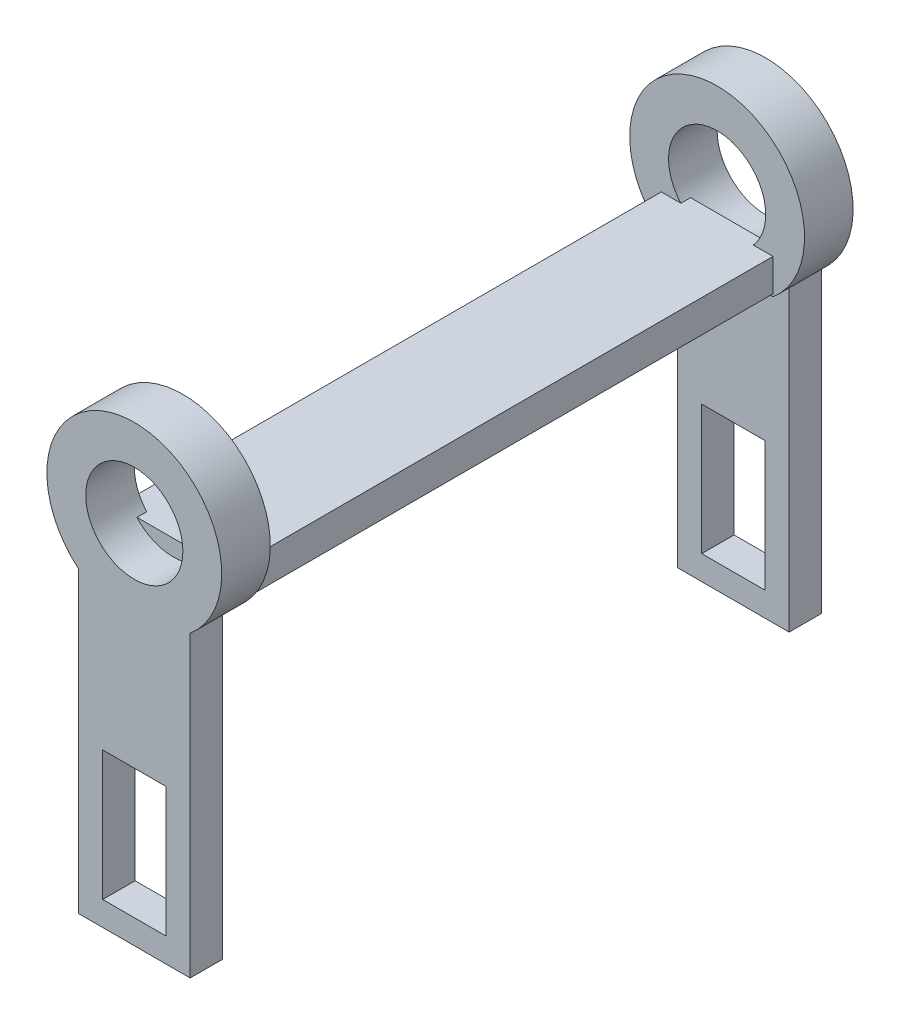
ISO-10303-21;
HEADER;
FILE_DESCRIPTION(('STEP AP214'),'2;1');
FILE_NAME('part.step','',(''),(''),'','','');
FILE_SCHEMA(('AUTOMOTIVE_DESIGN { 1 0 10303 214 1 1 1 1 }'));
ENDSEC;
DATA;
#1=APPLICATION_CONTEXT('core data for automotive mechanical design processes');
#2=APPLICATION_PROTOCOL_DEFINITION('international standard','automotive_design',2000,#1);
#3=PRODUCT_CONTEXT('',#1,'mechanical');
#4=PRODUCT('Part','Part','',(#3));
#5=PRODUCT_RELATED_PRODUCT_CATEGORY('part','',(#4));
#6=PRODUCT_DEFINITION_FORMATION('','',#4);
#7=PRODUCT_DEFINITION_CONTEXT('part definition',#1,'design');
#8=PRODUCT_DEFINITION('design','',#6,#7);
#9=PRODUCT_DEFINITION_SHAPE('','',#8);
#10=(LENGTH_UNIT() NAMED_UNIT(*) SI_UNIT(.MILLI.,.METRE.));
#11=(NAMED_UNIT(*) PLANE_ANGLE_UNIT() SI_UNIT($,.RADIAN.));
#12=(NAMED_UNIT(*) SI_UNIT($,.STERADIAN.) SOLID_ANGLE_UNIT());
#13=UNCERTAINTY_MEASURE_WITH_UNIT(LENGTH_MEASURE(1.E-05),#10,'distance_accuracy_value','');
#14=(GEOMETRIC_REPRESENTATION_CONTEXT(3) GLOBAL_UNCERTAINTY_ASSIGNED_CONTEXT((#13)) GLOBAL_UNIT_ASSIGNED_CONTEXT((#10,
#11,#12)) REPRESENTATION_CONTEXT('',''));
#15=CARTESIAN_POINT('',(0.,0.,0.));
#16=DIRECTION('',(0.,0.,1.));
#17=DIRECTION('',(1.,0.,0.));
#18=AXIS2_PLACEMENT_3D('',#15,#16,#17);
#19=CARTESIAN_POINT('',(0.,75.5,0.));
#20=DIRECTION('',(0.,1.,0.));
#21=DIRECTION('',(0.,0.,1.));
#22=AXIS2_PLACEMENT_3D('',#19,#20,#21);
#23=PLANE('',#22);
#24=DIRECTION('',(0.,0.,-1.));
#25=VECTOR('',#24,1.);
#26=CARTESIAN_POINT('',(11.180339887499,75.5,15.));
#27=LINE('',#26,#25);
#28=CARTESIAN_POINT('',(11.180339887499,75.5,15.));
#29=VERTEX_POINT('',#28);
#30=CARTESIAN_POINT('',(11.180339887499,75.5,12.));
#31=VERTEX_POINT('',#30);
#32=EDGE_CURVE('E290',#29,#31,#27,.T.);
#33=ORIENTED_EDGE('',*,*,#32,.T.);
#34=DIRECTION('',(-1.,0.,0.));
#35=VECTOR('',#34,1.);
#36=CARTESIAN_POINT('',(0.,75.5,12.));
#37=LINE('',#36,#35);
#38=CARTESIAN_POINT('',(-11.180339887499,75.5,12.));
#39=VERTEX_POINT('',#38);
#40=EDGE_CURVE('E266',#31,#39,#37,.T.);
#41=ORIENTED_EDGE('',*,*,#40,.T.);
#42=DIRECTION('',(0.,0.,-1.));
#43=VECTOR('',#42,1.);
#44=CARTESIAN_POINT('',(-11.180339887499,75.5,15.));
#45=LINE('',#44,#43);
#46=CARTESIAN_POINT('',(-11.180339887499,75.5,15.));
#47=VERTEX_POINT('',#46);
#48=EDGE_CURVE('E81',#47,#39,#45,.T.);
#49=ORIENTED_EDGE('',*,*,#48,.F.);
#50=DIRECTION('',(-1.,0.,0.));
#51=VECTOR('',#50,1.);
#52=CARTESIAN_POINT('',(0.,75.5,15.));
#53=LINE('',#52,#51);
#54=CARTESIAN_POINT('',(-17.25,75.5,15.));
#55=VERTEX_POINT('',#54);
#56=EDGE_CURVE('E275',#47,#55,#53,.T.);
#57=ORIENTED_EDGE('',*,*,#56,.T.);
#58=DIRECTION('',(0.,0.,1.));
#59=VECTOR('',#58,1.);
#60=CARTESIAN_POINT('',(-17.25,75.5,0.));
#61=LINE('',#60,#59);
#62=CARTESIAN_POINT('',(-17.25,75.5,180.));
#63=VERTEX_POINT('',#62);
#64=EDGE_CURVE('E396',#55,#63,#61,.T.);
#65=ORIENTED_EDGE('',*,*,#64,.T.);
#66=DIRECTION('',(-1.,0.,0.));
#67=VECTOR('',#66,1.);
#68=CARTESIAN_POINT('',(0.,75.5,180.));
#69=LINE('',#68,#67);
#70=CARTESIAN_POINT('',(-11.180339887499,75.5,180.));
#71=VERTEX_POINT('',#70);
#72=EDGE_CURVE('E314',#71,#63,#69,.T.);
#73=ORIENTED_EDGE('',*,*,#72,.F.);
#74=DIRECTION('',(0.,0.,1.));
#75=VECTOR('',#74,1.);
#76=CARTESIAN_POINT('',(-11.180339887499,75.5,180.));
#77=LINE('',#76,#75);
#78=CARTESIAN_POINT('',(-11.180339887499,75.5,183.));
#79=VERTEX_POINT('',#78);
#80=EDGE_CURVE('E334',#71,#79,#77,.T.);
#81=ORIENTED_EDGE('',*,*,#80,.T.);
#82=DIRECTION('',(1.,0.,0.));
#83=VECTOR('',#82,1.);
#84=CARTESIAN_POINT('',(0.,75.5,183.));
#85=LINE('',#84,#83);
#86=CARTESIAN_POINT('',(11.180339887499,75.5,183.));
#87=VERTEX_POINT('',#86);
#88=EDGE_CURVE('E303',#79,#87,#85,.T.);
#89=ORIENTED_EDGE('',*,*,#88,.T.);
#90=DIRECTION('',(0.,0.,1.));
#91=VECTOR('',#90,1.);
#92=CARTESIAN_POINT('',(11.180339887499,75.5,180.));
#93=LINE('',#92,#91);
#94=CARTESIAN_POINT('',(11.180339887499,75.5,180.));
#95=VERTEX_POINT('',#94);
#96=EDGE_CURVE('E331',#95,#87,#93,.T.);
#97=ORIENTED_EDGE('',*,*,#96,.F.);
#98=DIRECTION('',(-1.,0.,0.));
#99=VECTOR('',#98,1.);
#100=CARTESIAN_POINT('',(0.,75.5,180.));
#101=LINE('',#100,#99);
#102=CARTESIAN_POINT('',(17.25,75.5,180.));
#103=VERTEX_POINT('',#102);
#104=EDGE_CURVE('E320',#103,#95,#101,.T.);
#105=ORIENTED_EDGE('',*,*,#104,.F.);
#106=DIRECTION('',(0.,0.,-1.));
#107=VECTOR('',#106,1.);
#108=CARTESIAN_POINT('',(17.25,75.5,10.));
#109=LINE('',#108,#107);
#110=CARTESIAN_POINT('',(17.25,75.5,15.));
#111=VERTEX_POINT('',#110);
#112=EDGE_CURVE('E249',#103,#111,#109,.T.);
#113=ORIENTED_EDGE('',*,*,#112,.T.);
#114=DIRECTION('',(-1.,0.,0.));
#115=VECTOR('',#114,1.);
#116=CARTESIAN_POINT('',(0.,75.5,15.));
#117=LINE('',#116,#115);
#118=EDGE_CURVE('E74',#111,#29,#117,.T.);
#119=ORIENTED_EDGE('',*,*,#118,.T.);
#120=EDGE_LOOP('',(#33,#41,#49,#57,#65,#73,#81,#89,#97,#105,#113,#119));
#121=FACE_BOUND('',#120,.T.);
#122=ADVANCED_FACE('F59',(#121),#23,.T.);
#123=CARTESIAN_POINT('',(0.,0.,0.));
#124=DIRECTION('',(0.,0.,-1.));
#125=DIRECTION('',(-1.,0.,0.));
#126=AXIS2_PLACEMENT_3D('',#123,#124,#125);
#127=PLANE('',#126);
#128=DIRECTION('',(0.,1.,0.));
#129=VECTOR('',#128,1.);
#130=CARTESIAN_POINT('',(-17.25,-27.5,0.));
#131=LINE('',#130,#129);
#132=CARTESIAN_POINT('',(-17.25,-27.5,0.));
#133=VERTEX_POINT('',#132);
#134=CARTESIAN_POINT('',(-17.25,64.7289263638107,0.));
#135=VERTEX_POINT('',#134);
#136=EDGE_CURVE('E423',#133,#135,#131,.T.);
#137=ORIENTED_EDGE('',*,*,#136,.T.);
#138=CARTESIAN_POINT('',(0.,85.5,0.));
#139=DIRECTION('',(0.,0.,1.));
#140=DIRECTION('',(1.,0.,0.));
#141=AXIS2_PLACEMENT_3D('',#138,#139,#140);
#142=CIRCLE('',#141,27.);
#143=CARTESIAN_POINT('',(17.25,64.7289263638106,0.));
#144=VERTEX_POINT('',#143);
#145=EDGE_CURVE('E268',#135,#144,#142,.F.);
#146=ORIENTED_EDGE('',*,*,#145,.T.);
#147=DIRECTION('',(0.,1.,0.));
#148=VECTOR('',#147,1.);
#149=CARTESIAN_POINT('',(17.25,-27.5,0.));
#150=LINE('',#149,#148);
#151=CARTESIAN_POINT('',(17.25,-27.5,0.));
#152=VERTEX_POINT('',#151);
#153=EDGE_CURVE('E441',#152,#144,#150,.T.);
#154=ORIENTED_EDGE('',*,*,#153,.F.);
#155=DIRECTION('',(1.,0.,0.));
#156=VECTOR('',#155,1.);
#157=CARTESIAN_POINT('',(-17.25,-27.5,0.));
#158=LINE('',#157,#156);
#159=EDGE_CURVE('E434',#133,#152,#158,.T.);
#160=ORIENTED_EDGE('',*,*,#159,.F.);
#161=EDGE_LOOP('',(#137,#146,#154,#160));
#162=FACE_BOUND('',#161,.T.);
#163=DIRECTION('',(1.,0.,0.));
#164=VECTOR('',#163,1.);
#165=CARTESIAN_POINT('',(-9.75,20.,0.));
#166=LINE('',#165,#164);
#167=CARTESIAN_POINT('',(-9.75,20.,0.));
#168=VERTEX_POINT('',#167);
#169=CARTESIAN_POINT('',(9.75,20.,0.));
#170=VERTEX_POINT('',#169);
#171=EDGE_CURVE('E398',#168,#170,#166,.T.);
#172=ORIENTED_EDGE('',*,*,#171,.F.);
#173=DIRECTION('',(0.,1.,0.));
#174=VECTOR('',#173,1.);
#175=CARTESIAN_POINT('',(-9.75,-20.,0.));
#176=LINE('',#175,#174);
#177=CARTESIAN_POINT('',(-9.75,-20.,0.));
#178=VERTEX_POINT('',#177);
#179=EDGE_CURVE('E403',#178,#168,#176,.T.);
#180=ORIENTED_EDGE('',*,*,#179,.F.);
#181=DIRECTION('',(1.,0.,0.));
#182=VECTOR('',#181,1.);
#183=CARTESIAN_POINT('',(-9.75,-20.,0.));
#184=LINE('',#183,#182);
#185=CARTESIAN_POINT('',(9.75,-20.,0.));
#186=VERTEX_POINT('',#185);
#187=EDGE_CURVE('E416',#178,#186,#184,.T.);
#188=ORIENTED_EDGE('',*,*,#187,.T.);
#189=DIRECTION('',(0.,1.,0.));
#190=VECTOR('',#189,1.);
#191=CARTESIAN_POINT('',(9.75,-20.,0.));
#192=LINE('',#191,#190);
#193=EDGE_CURVE('E413',#186,#170,#192,.T.);
#194=ORIENTED_EDGE('',*,*,#193,.T.);
#195=EDGE_LOOP('',(#172,#180,#188,#194));
#196=FACE_BOUND('',#195,.T.);
#197=CARTESIAN_POINT('',(0.,85.5,0.));
#198=DIRECTION('',(0.,0.,1.));
#199=DIRECTION('',(1.,0.,0.));
#200=AXIS2_PLACEMENT_3D('',#197,#198,#199);
#201=CIRCLE('',#200,15.);
#202=CARTESIAN_POINT('',(15.,85.5,0.));
#203=VERTEX_POINT('',#202);
#204=EDGE_CURVE('E269',#203,#203,#201,.T.);
#205=ORIENTED_EDGE('',*,*,#204,.T.);
#206=EDGE_LOOP('',(#205));
#207=FACE_BOUND('',#206,.T.);
#208=ADVANCED_FACE('F456',(#162,#196,#207),#127,.T.);
#209=CARTESIAN_POINT('',(-17.25,-27.5,10.));
#210=DIRECTION('',(-1.,0.,0.));
#211=DIRECTION('',(0.,0.,1.));
#212=AXIS2_PLACEMENT_3D('',#209,#210,#211);
#213=PLANE('',#212);
#214=ORIENTED_EDGE('',*,*,#64,.F.);
#215=DIRECTION('',(0.,-1.,0.));
#216=VECTOR('',#215,1.);
#217=CARTESIAN_POINT('',(-17.25,0.,15.));
#218=LINE('',#217,#216);
#219=CARTESIAN_POINT('',(-17.25,65.5,15.));
#220=VERTEX_POINT('',#219);
#221=EDGE_CURVE('E277',#55,#220,#218,.T.);
#222=ORIENTED_EDGE('',*,*,#221,.T.);
#223=DIRECTION('',(0.,0.,-1.));
#224=VECTOR('',#223,1.);
#225=CARTESIAN_POINT('',(-17.25,65.5,97.5));
#226=LINE('',#225,#224);
#227=CARTESIAN_POINT('',(-17.25,65.5,180.));
#228=VERTEX_POINT('',#227);
#229=EDGE_CURVE('E250',#228,#220,#226,.T.);
#230=ORIENTED_EDGE('',*,*,#229,.F.);
#231=DIRECTION('',(0.,-1.,0.));
#232=VECTOR('',#231,1.);
#233=CARTESIAN_POINT('',(-17.25,0.,180.));
#234=LINE('',#233,#232);
#235=EDGE_CURVE('E310',#63,#228,#234,.T.);
#236=ORIENTED_EDGE('',*,*,#235,.F.);
#237=EDGE_LOOP('',(#214,#222,#230,#236));
#238=FACE_BOUND('',#237,.T.);
#239=ADVANCED_FACE('F470',(#238),#213,.T.);
#240=CARTESIAN_POINT('',(17.25,-27.5,10.));
#241=DIRECTION('',(-1.,0.,0.));
#242=DIRECTION('',(0.,0.,1.));
#243=AXIS2_PLACEMENT_3D('',#240,#241,#242);
#244=PLANE('',#243);
#245=DIRECTION('',(0.,1.,0.));
#246=VECTOR('',#245,1.);
#247=CARTESIAN_POINT('',(17.25,0.,15.));
#248=LINE('',#247,#246);
#249=CARTESIAN_POINT('',(17.25,65.5,15.));
#250=VERTEX_POINT('',#249);
#251=EDGE_CURVE('E232',#250,#111,#248,.T.);
#252=ORIENTED_EDGE('',*,*,#251,.T.);
#253=ORIENTED_EDGE('',*,*,#112,.F.);
#254=DIRECTION('',(0.,1.,0.));
#255=VECTOR('',#254,1.);
#256=CARTESIAN_POINT('',(17.25,0.,180.));
#257=LINE('',#256,#255);
#258=CARTESIAN_POINT('',(17.25,65.5,180.));
#259=VERTEX_POINT('',#258);
#260=EDGE_CURVE('E247',#259,#103,#257,.T.);
#261=ORIENTED_EDGE('',*,*,#260,.F.);
#262=DIRECTION('',(0.,0.,-1.));
#263=VECTOR('',#262,1.);
#264=CARTESIAN_POINT('',(17.25,65.5,97.5));
#265=LINE('',#264,#263);
#266=EDGE_CURVE('E245',#259,#250,#265,.T.);
#267=ORIENTED_EDGE('',*,*,#266,.T.);
#268=EDGE_LOOP('',(#252,#253,#261,#267));
#269=FACE_BOUND('',#268,.T.);
#270=ADVANCED_FACE('F246',(#269),#244,.F.);
#271=CARTESIAN_POINT('',(-17.25,65.5,97.5));
#272=DIRECTION('',(0.,1.,0.));
#273=DIRECTION('',(0.,0.,1.));
#274=AXIS2_PLACEMENT_3D('',#271,#272,#273);
#275=PLANE('',#274);
#276=ORIENTED_EDGE('',*,*,#229,.T.);
#277=DIRECTION('',(1.,0.,0.));
#278=VECTOR('',#277,1.);
#279=CARTESIAN_POINT('',(-27.002,65.5,15.));
#280=LINE('',#279,#278);
#281=EDGE_CURVE('E237',#220,#250,#280,.T.);
#282=ORIENTED_EDGE('',*,*,#281,.T.);
#283=ORIENTED_EDGE('',*,*,#266,.F.);
#284=DIRECTION('',(1.,0.,0.));
#285=VECTOR('',#284,1.);
#286=CARTESIAN_POINT('',(-27.002,65.5,180.));
#287=LINE('',#286,#285);
#288=EDGE_CURVE('E296',#228,#259,#287,.T.);
#289=ORIENTED_EDGE('',*,*,#288,.F.);
#290=EDGE_LOOP('',(#276,#282,#283,#289));
#291=FACE_BOUND('',#290,.T.);
#292=ADVANCED_FACE('F253',(#291),#275,.F.);
#293=CARTESIAN_POINT('',(0.,0.,185.));
#294=DIRECTION('',(0.,0.,1.));
#295=DIRECTION('',(-1.,0.,0.));
#296=AXIS2_PLACEMENT_3D('',#293,#294,#295);
#297=PLANE('',#296);
#298=DIRECTION('',(0.,1.,0.));
#299=VECTOR('',#298,1.);
#300=CARTESIAN_POINT('',(-9.75,-20.,185.));
#301=LINE('',#300,#299);
#302=CARTESIAN_POINT('',(-9.75,-20.,185.));
#303=VERTEX_POINT('',#302);
#304=CARTESIAN_POINT('',(-9.75,20.,185.));
#305=VERTEX_POINT('',#304);
#306=EDGE_CURVE('E350',#303,#305,#301,.T.);
#307=ORIENTED_EDGE('',*,*,#306,.F.);
#308=DIRECTION('',(1.,0.,0.));
#309=VECTOR('',#308,1.);
#310=CARTESIAN_POINT('',(-9.75,-20.,185.));
#311=LINE('',#310,#309);
#312=CARTESIAN_POINT('',(9.75,-20.,185.));
#313=VERTEX_POINT('',#312);
#314=EDGE_CURVE('E347',#303,#313,#311,.T.);
#315=ORIENTED_EDGE('',*,*,#314,.T.);
#316=DIRECTION('',(0.,1.,0.));
#317=VECTOR('',#316,1.);
#318=CARTESIAN_POINT('',(9.75,-20.,185.));
#319=LINE('',#318,#317);
#320=CARTESIAN_POINT('',(9.75,20.,185.));
#321=VERTEX_POINT('',#320);
#322=EDGE_CURVE('E343',#313,#321,#319,.T.);
#323=ORIENTED_EDGE('',*,*,#322,.T.);
#324=DIRECTION('',(1.,0.,0.));
#325=VECTOR('',#324,1.);
#326=CARTESIAN_POINT('',(-9.75,20.,185.));
#327=LINE('',#326,#325);
#328=EDGE_CURVE('E340',#305,#321,#327,.T.);
#329=ORIENTED_EDGE('',*,*,#328,.F.);
#330=EDGE_LOOP('',(#307,#315,#323,#329));
#331=FACE_BOUND('',#330,.T.);
#332=DIRECTION('',(1.,0.,0.));
#333=VECTOR('',#332,1.);
#334=CARTESIAN_POINT('',(-27.002,64.7289263638106,185.));
#335=LINE('',#334,#333);
#336=CARTESIAN_POINT('',(-17.25,64.7289263638106,185.));
#337=VERTEX_POINT('',#336);
#338=CARTESIAN_POINT('',(17.25,64.7289263638106,185.));
#339=VERTEX_POINT('',#338);
#340=EDGE_CURVE('E298',#337,#339,#335,.T.);
#341=ORIENTED_EDGE('',*,*,#340,.T.);
#342=DIRECTION('',(0.,1.,0.));
#343=VECTOR('',#342,1.);
#344=CARTESIAN_POINT('',(17.25,-27.5,185.));
#345=LINE('',#344,#343);
#346=CARTESIAN_POINT('',(17.25,-27.5,185.));
#347=VERTEX_POINT('',#346);
#348=EDGE_CURVE('E375',#347,#339,#345,.T.);
#349=ORIENTED_EDGE('',*,*,#348,.F.);
#350=DIRECTION('',(1.,0.,0.));
#351=VECTOR('',#350,1.);
#352=CARTESIAN_POINT('',(-17.25,-27.5,185.));
#353=LINE('',#352,#351);
#354=CARTESIAN_POINT('',(-17.25,-27.5,185.));
#355=VERTEX_POINT('',#354);
#356=EDGE_CURVE('E379',#355,#347,#353,.T.);
#357=ORIENTED_EDGE('',*,*,#356,.F.);
#358=DIRECTION('',(0.,1.,0.));
#359=VECTOR('',#358,1.);
#360=CARTESIAN_POINT('',(-17.25,-27.5,185.));
#361=LINE('',#360,#359);
#362=EDGE_CURVE('E372',#355,#337,#361,.T.);
#363=ORIENTED_EDGE('',*,*,#362,.T.);
#364=EDGE_LOOP('',(#341,#349,#357,#363));
#365=FACE_BOUND('',#364,.T.);
#366=ADVANCED_FACE('F476',(#331,#365),#297,.F.);
#367=DIRECTION('',(0.,1.,0.));
#368=VECTOR('',#367,1.);
#369=CARTESIAN_POINT('',(-17.25,-27.5,195.));
#370=LINE('',#369,#368);
#371=CARTESIAN_POINT('',(-17.25,-27.5,195.));
#372=VERTEX_POINT('',#371);
#373=CARTESIAN_POINT('',(-17.25,64.7289263638107,195.));
#374=VERTEX_POINT('',#373);
#375=EDGE_CURVE('E366',#372,#374,#370,.T.);
#376=ORIENTED_EDGE('',*,*,#375,.T.);
#377=DIRECTION('',(0.,0.,1.));
#378=VECTOR('',#377,1.);
#379=CARTESIAN_POINT('',(-17.25,64.7289263638107,180.));
#380=LINE('',#379,#378);
#381=EDGE_CURVE('E323',#337,#374,#380,.T.);
#382=ORIENTED_EDGE('',*,*,#381,.F.);
#383=ORIENTED_EDGE('',*,*,#362,.F.);
#384=DIRECTION('',(0.,0.,1.));
#385=VECTOR('',#384,1.);
#386=CARTESIAN_POINT('',(-17.25,-27.5,185.));
#387=LINE('',#386,#385);
#388=EDGE_CURVE('E389',#355,#372,#387,.T.);
#389=ORIENTED_EDGE('',*,*,#388,.T.);
#390=EDGE_LOOP('',(#376,#382,#383,#389));
#391=FACE_BOUND('',#390,.T.);
#392=ADVANCED_FACE('F61',(#391),#213,.T.);
#393=DIRECTION('',(0.,0.,-1.));
#394=VECTOR('',#393,1.);
#395=CARTESIAN_POINT('',(-17.25,64.7289263638107,15.));
#396=LINE('',#395,#394);
#397=CARTESIAN_POINT('',(-17.25,64.7289263638107,10.));
#398=VERTEX_POINT('',#397);
#399=EDGE_CURVE('E288',#398,#135,#396,.T.);
#400=ORIENTED_EDGE('',*,*,#399,.T.);
#401=ORIENTED_EDGE('',*,*,#136,.F.);
#402=DIRECTION('',(0.,0.,-1.));
#403=VECTOR('',#402,1.);
#404=CARTESIAN_POINT('',(-17.25,-27.5,10.));
#405=LINE('',#404,#403);
#406=CARTESIAN_POINT('',(-17.25,-27.5,10.));
#407=VERTEX_POINT('',#406);
#408=EDGE_CURVE('E12',#407,#133,#405,.T.);
#409=ORIENTED_EDGE('',*,*,#408,.F.);
#410=DIRECTION('',(0.,1.,0.));
#411=VECTOR('',#410,1.);
#412=CARTESIAN_POINT('',(-17.25,-27.5,10.));
#413=LINE('',#412,#411);
#414=EDGE_CURVE('E430',#407,#398,#413,.T.);
#415=ORIENTED_EDGE('',*,*,#414,.T.);
#416=EDGE_LOOP('',(#400,#401,#409,#415));
#417=FACE_BOUND('',#416,.T.);
#418=ADVANCED_FACE('F467',(#417),#213,.T.);
#419=DIRECTION('',(0.,0.,1.));
#420=VECTOR('',#419,1.);
#421=CARTESIAN_POINT('',(17.25,64.7289263638106,180.));
#422=LINE('',#421,#420);
#423=CARTESIAN_POINT('',(17.25,64.7289263638106,195.));
#424=VERTEX_POINT('',#423);
#425=EDGE_CURVE('E330',#339,#424,#422,.T.);
#426=ORIENTED_EDGE('',*,*,#425,.T.);
#427=DIRECTION('',(0.,1.,0.));
#428=VECTOR('',#427,1.);
#429=CARTESIAN_POINT('',(17.25,-27.5,195.));
#430=LINE('',#429,#428);
#431=CARTESIAN_POINT('',(17.25,-27.5,195.));
#432=VERTEX_POINT('',#431);
#433=EDGE_CURVE('E384',#432,#424,#430,.T.);
#434=ORIENTED_EDGE('',*,*,#433,.F.);
#435=DIRECTION('',(0.,0.,1.));
#436=VECTOR('',#435,1.);
#437=CARTESIAN_POINT('',(17.25,-27.5,185.));
#438=LINE('',#437,#436);
#439=EDGE_CURVE('E382',#347,#432,#438,.T.);
#440=ORIENTED_EDGE('',*,*,#439,.F.);
#441=ORIENTED_EDGE('',*,*,#348,.T.);
#442=EDGE_LOOP('',(#426,#434,#440,#441));
#443=FACE_BOUND('',#442,.T.);
#444=ADVANCED_FACE('F469',(#443),#244,.F.);
#445=ORIENTED_EDGE('',*,*,#153,.T.);
#446=DIRECTION('',(0.,0.,-1.));
#447=VECTOR('',#446,1.);
#448=CARTESIAN_POINT('',(17.25,64.7289263638106,15.));
#449=LINE('',#448,#447);
#450=CARTESIAN_POINT('',(17.25,64.7289263638106,10.));
#451=VERTEX_POINT('',#450);
#452=EDGE_CURVE('E279',#451,#144,#449,.T.);
#453=ORIENTED_EDGE('',*,*,#452,.F.);
#454=DIRECTION('',(0.,1.,0.));
#455=VECTOR('',#454,1.);
#456=CARTESIAN_POINT('',(17.25,-27.5,10.));
#457=LINE('',#456,#455);
#458=CARTESIAN_POINT('',(17.25,-27.5,10.));
#459=VERTEX_POINT('',#458);
#460=EDGE_CURVE('E433',#459,#451,#457,.T.);
#461=ORIENTED_EDGE('',*,*,#460,.F.);
#462=DIRECTION('',(0.,0.,-1.));
#463=VECTOR('',#462,1.);
#464=CARTESIAN_POINT('',(17.25,-27.5,10.));
#465=LINE('',#464,#463);
#466=EDGE_CURVE('E63',#459,#152,#465,.T.);
#467=ORIENTED_EDGE('',*,*,#466,.T.);
#468=EDGE_LOOP('',(#445,#453,#461,#467));
#469=FACE_BOUND('',#468,.T.);
#470=ADVANCED_FACE('F454',(#469),#244,.F.);
#471=CARTESIAN_POINT('',(0.,0.,10.));
#472=DIRECTION('',(0.,0.,-1.));
#473=DIRECTION('',(-1.,0.,0.));
#474=AXIS2_PLACEMENT_3D('',#471,#472,#473);
#475=PLANE('',#474);
#476=DIRECTION('',(0.,1.,0.));
#477=VECTOR('',#476,1.);
#478=CARTESIAN_POINT('',(-9.75,-20.,10.));
#479=LINE('',#478,#477);
#480=CARTESIAN_POINT('',(-9.75,-20.,10.));
#481=VERTEX_POINT('',#480);
#482=CARTESIAN_POINT('',(-9.75,20.,10.));
#483=VERTEX_POINT('',#482);
#484=EDGE_CURVE('E408',#481,#483,#479,.T.);
#485=ORIENTED_EDGE('',*,*,#484,.T.);
#486=DIRECTION('',(1.,0.,0.));
#487=VECTOR('',#486,1.);
#488=CARTESIAN_POINT('',(-9.75,20.,10.));
#489=LINE('',#488,#487);
#490=CARTESIAN_POINT('',(9.75,20.,10.));
#491=VERTEX_POINT('',#490);
#492=EDGE_CURVE('E399',#483,#491,#489,.T.);
#493=ORIENTED_EDGE('',*,*,#492,.T.);
#494=DIRECTION('',(0.,1.,0.));
#495=VECTOR('',#494,1.);
#496=CARTESIAN_POINT('',(9.75,-20.,10.));
#497=LINE('',#496,#495);
#498=CARTESIAN_POINT('',(9.75,-20.,10.));
#499=VERTEX_POINT('',#498);
#500=EDGE_CURVE('E402',#499,#491,#497,.T.);
#501=ORIENTED_EDGE('',*,*,#500,.F.);
#502=DIRECTION('',(1.,0.,0.));
#503=VECTOR('',#502,1.);
#504=CARTESIAN_POINT('',(-9.75,-20.,10.));
#505=LINE('',#504,#503);
#506=EDGE_CURVE('E405',#481,#499,#505,.T.);
#507=ORIENTED_EDGE('',*,*,#506,.F.);
#508=EDGE_LOOP('',(#485,#493,#501,#507));
#509=FACE_BOUND('',#508,.T.);
#510=ORIENTED_EDGE('',*,*,#460,.T.);
#511=DIRECTION('',(1.,0.,0.));
#512=VECTOR('',#511,1.);
#513=CARTESIAN_POINT('',(-27.002,64.7289263638106,10.));
#514=LINE('',#513,#512);
#515=EDGE_CURVE('E256',#398,#451,#514,.T.);
#516=ORIENTED_EDGE('',*,*,#515,.F.);
#517=ORIENTED_EDGE('',*,*,#414,.F.);
#518=DIRECTION('',(1.,0.,0.));
#519=VECTOR('',#518,1.);
#520=CARTESIAN_POINT('',(-17.25,-27.5,10.));
#521=LINE('',#520,#519);
#522=EDGE_CURVE('E437',#407,#459,#521,.T.);
#523=ORIENTED_EDGE('',*,*,#522,.T.);
#524=EDGE_LOOP('',(#510,#516,#517,#523));
#525=FACE_BOUND('',#524,.T.);
#526=ADVANCED_FACE('F464',(#509,#525),#475,.F.);
#527=CARTESIAN_POINT('',(-17.25,-27.5,10.));
#528=DIRECTION('',(0.,1.,0.));
#529=DIRECTION('',(0.,0.,1.));
#530=AXIS2_PLACEMENT_3D('',#527,#528,#529);
#531=PLANE('',#530);
#532=ORIENTED_EDGE('',*,*,#159,.T.);
#533=ORIENTED_EDGE('',*,*,#466,.F.);
#534=ORIENTED_EDGE('',*,*,#522,.F.);
#535=ORIENTED_EDGE('',*,*,#408,.T.);
#536=EDGE_LOOP('',(#532,#533,#534,#535));
#537=FACE_BOUND('',#536,.T.);
#538=ADVANCED_FACE('F447',(#537),#531,.F.);
#539=CARTESIAN_POINT('',(-9.75,20.,10.));
#540=DIRECTION('',(0.,1.,0.));
#541=DIRECTION('',(0.,0.,1.));
#542=AXIS2_PLACEMENT_3D('',#539,#540,#541);
#543=PLANE('',#542);
#544=ORIENTED_EDGE('',*,*,#171,.T.);
#545=DIRECTION('',(0.,0.,-1.));
#546=VECTOR('',#545,1.);
#547=CARTESIAN_POINT('',(9.75,20.,10.));
#548=LINE('',#547,#546);
#549=EDGE_CURVE('E411',#491,#170,#548,.T.);
#550=ORIENTED_EDGE('',*,*,#549,.F.);
#551=ORIENTED_EDGE('',*,*,#492,.F.);
#552=DIRECTION('',(0.,0.,-1.));
#553=VECTOR('',#552,1.);
#554=CARTESIAN_POINT('',(-9.75,20.,10.));
#555=LINE('',#554,#553);
#556=EDGE_CURVE('E421',#483,#168,#555,.T.);
#557=ORIENTED_EDGE('',*,*,#556,.T.);
#558=EDGE_LOOP('',(#544,#550,#551,#557));
#559=FACE_BOUND('',#558,.T.);
#560=ADVANCED_FACE('F493',(#559),#543,.F.);
#561=CARTESIAN_POINT('',(-9.75,-20.,10.));
#562=DIRECTION('',(-1.,0.,0.));
#563=DIRECTION('',(0.,0.,1.));
#564=AXIS2_PLACEMENT_3D('',#561,#562,#563);
#565=PLANE('',#564);
#566=ORIENTED_EDGE('',*,*,#179,.T.);
#567=ORIENTED_EDGE('',*,*,#556,.F.);
#568=ORIENTED_EDGE('',*,*,#484,.F.);
#569=DIRECTION('',(0.,0.,-1.));
#570=VECTOR('',#569,1.);
#571=CARTESIAN_POINT('',(-9.75,-20.,10.));
#572=LINE('',#571,#570);
#573=EDGE_CURVE('E424',#481,#178,#572,.T.);
#574=ORIENTED_EDGE('',*,*,#573,.T.);
#575=EDGE_LOOP('',(#566,#567,#568,#574));
#576=FACE_BOUND('',#575,.T.);
#577=ADVANCED_FACE('F489',(#576),#565,.F.);
#578=CARTESIAN_POINT('',(-9.75,-20.,10.));
#579=DIRECTION('',(0.,1.,0.));
#580=DIRECTION('',(0.,0.,1.));
#581=AXIS2_PLACEMENT_3D('',#578,#579,#580);
#582=PLANE('',#581);
#583=ORIENTED_EDGE('',*,*,#187,.F.);
#584=ORIENTED_EDGE('',*,*,#573,.F.);
#585=ORIENTED_EDGE('',*,*,#506,.T.);
#586=DIRECTION('',(0.,0.,-1.));
#587=VECTOR('',#586,1.);
#588=CARTESIAN_POINT('',(9.75,-20.,10.));
#589=LINE('',#588,#587);
#590=EDGE_CURVE('E426',#499,#186,#589,.T.);
#591=ORIENTED_EDGE('',*,*,#590,.T.);
#592=EDGE_LOOP('',(#583,#584,#585,#591));
#593=FACE_BOUND('',#592,.T.);
#594=ADVANCED_FACE('F492',(#593),#582,.T.);
#595=CARTESIAN_POINT('',(9.75,-20.,10.));
#596=DIRECTION('',(-1.,0.,0.));
#597=DIRECTION('',(0.,0.,1.));
#598=AXIS2_PLACEMENT_3D('',#595,#596,#597);
#599=PLANE('',#598);
#600=ORIENTED_EDGE('',*,*,#193,.F.);
#601=ORIENTED_EDGE('',*,*,#590,.F.);
#602=ORIENTED_EDGE('',*,*,#500,.T.);
#603=ORIENTED_EDGE('',*,*,#549,.T.);
#604=EDGE_LOOP('',(#600,#601,#602,#603));
#605=FACE_BOUND('',#604,.T.);
#606=ADVANCED_FACE('F497',(#605),#599,.T.);
#607=CARTESIAN_POINT('',(-17.25,-27.5,185.));
#608=DIRECTION('',(0.,1.,0.));
#609=DIRECTION('',(0.,0.,-1.));
#610=AXIS2_PLACEMENT_3D('',#607,#608,#609);
#611=PLANE('',#610);
#612=DIRECTION('',(1.,0.,0.));
#613=VECTOR('',#612,1.);
#614=CARTESIAN_POINT('',(-17.25,-27.5,195.));
#615=LINE('',#614,#613);
#616=EDGE_CURVE('E376',#372,#432,#615,.T.);
#617=ORIENTED_EDGE('',*,*,#616,.F.);
#618=ORIENTED_EDGE('',*,*,#388,.F.);
#619=ORIENTED_EDGE('',*,*,#356,.T.);
#620=ORIENTED_EDGE('',*,*,#439,.T.);
#621=EDGE_LOOP('',(#617,#618,#619,#620));
#622=FACE_BOUND('',#621,.T.);
#623=ADVANCED_FACE('F501',(#622),#611,.F.);
#624=CARTESIAN_POINT('',(0.,0.,195.));
#625=DIRECTION('',(0.,0.,1.));
#626=DIRECTION('',(-1.,0.,0.));
#627=AXIS2_PLACEMENT_3D('',#624,#625,#626);
#628=PLANE('',#627);
#629=CARTESIAN_POINT('',(0.,85.5,195.));
#630=DIRECTION('',(0.,0.,1.));
#631=DIRECTION('',(1.,0.,0.));
#632=AXIS2_PLACEMENT_3D('',#629,#630,#631);
#633=CIRCLE('',#632,15.);
#634=CARTESIAN_POINT('',(15.,85.5,195.));
#635=VERTEX_POINT('',#634);
#636=EDGE_CURVE('E311',#635,#635,#633,.T.);
#637=ORIENTED_EDGE('',*,*,#636,.F.);
#638=EDGE_LOOP('',(#637));
#639=FACE_BOUND('',#638,.T.);
#640=DIRECTION('',(1.,0.,0.));
#641=VECTOR('',#640,1.);
#642=CARTESIAN_POINT('',(-9.75,20.,195.));
#643=LINE('',#642,#641);
#644=CARTESIAN_POINT('',(-9.75,20.,195.));
#645=VERTEX_POINT('',#644);
#646=CARTESIAN_POINT('',(9.75,20.,195.));
#647=VERTEX_POINT('',#646);
#648=EDGE_CURVE('E329',#645,#647,#643,.T.);
#649=ORIENTED_EDGE('',*,*,#648,.T.);
#650=DIRECTION('',(0.,1.,0.));
#651=VECTOR('',#650,1.);
#652=CARTESIAN_POINT('',(9.75,-20.,195.));
#653=LINE('',#652,#651);
#654=CARTESIAN_POINT('',(9.75,-20.,195.));
#655=VERTEX_POINT('',#654);
#656=EDGE_CURVE('E356',#655,#647,#653,.T.);
#657=ORIENTED_EDGE('',*,*,#656,.F.);
#658=DIRECTION('',(1.,0.,0.));
#659=VECTOR('',#658,1.);
#660=CARTESIAN_POINT('',(-9.75,-20.,195.));
#661=LINE('',#660,#659);
#662=CARTESIAN_POINT('',(-9.75,-20.,195.));
#663=VERTEX_POINT('',#662);
#664=EDGE_CURVE('E359',#663,#655,#661,.T.);
#665=ORIENTED_EDGE('',*,*,#664,.F.);
#666=DIRECTION('',(0.,1.,0.));
#667=VECTOR('',#666,1.);
#668=CARTESIAN_POINT('',(-9.75,-20.,195.));
#669=LINE('',#668,#667);
#670=EDGE_CURVE('E344',#663,#645,#669,.T.);
#671=ORIENTED_EDGE('',*,*,#670,.T.);
#672=EDGE_LOOP('',(#649,#657,#665,#671));
#673=FACE_BOUND('',#672,.T.);
#674=ORIENTED_EDGE('',*,*,#375,.F.);
#675=ORIENTED_EDGE('',*,*,#616,.T.);
#676=ORIENTED_EDGE('',*,*,#433,.T.);
#677=CARTESIAN_POINT('',(0.,85.5,195.));
#678=DIRECTION('',(0.,0.,1.));
#679=DIRECTION('',(1.,0.,0.));
#680=AXIS2_PLACEMENT_3D('',#677,#678,#679);
#681=CIRCLE('',#680,27.);
#682=EDGE_CURVE('E306',#374,#424,#681,.F.);
#683=ORIENTED_EDGE('',*,*,#682,.F.);
#684=EDGE_LOOP('',(#674,#675,#676,#683));
#685=FACE_BOUND('',#684,.T.);
#686=ADVANCED_FACE('F537',(#639,#673,#685),#628,.T.);
#687=CARTESIAN_POINT('',(-9.75,20.,185.));
#688=DIRECTION('',(0.,1.,0.));
#689=DIRECTION('',(0.,0.,-1.));
#690=AXIS2_PLACEMENT_3D('',#687,#688,#689);
#691=PLANE('',#690);
#692=ORIENTED_EDGE('',*,*,#648,.F.);
#693=DIRECTION('',(0.,0.,1.));
#694=VECTOR('',#693,1.);
#695=CARTESIAN_POINT('',(-9.75,20.,185.));
#696=LINE('',#695,#694);
#697=EDGE_CURVE('E364',#305,#645,#696,.T.);
#698=ORIENTED_EDGE('',*,*,#697,.F.);
#699=ORIENTED_EDGE('',*,*,#328,.T.);
#700=DIRECTION('',(0.,0.,1.));
#701=VECTOR('',#700,1.);
#702=CARTESIAN_POINT('',(9.75,20.,185.));
#703=LINE('',#702,#701);
#704=EDGE_CURVE('E353',#321,#647,#703,.T.);
#705=ORIENTED_EDGE('',*,*,#704,.T.);
#706=EDGE_LOOP('',(#692,#698,#699,#705));
#707=FACE_BOUND('',#706,.T.);
#708=ADVANCED_FACE('F545',(#707),#691,.F.);
#709=CARTESIAN_POINT('',(-9.75,-20.,185.));
#710=DIRECTION('',(-1.,0.,0.));
#711=DIRECTION('',(0.,0.,-1.));
#712=AXIS2_PLACEMENT_3D('',#709,#710,#711);
#713=PLANE('',#712);
#714=ORIENTED_EDGE('',*,*,#670,.F.);
#715=DIRECTION('',(0.,0.,1.));
#716=VECTOR('',#715,1.);
#717=CARTESIAN_POINT('',(-9.75,-20.,185.));
#718=LINE('',#717,#716);
#719=EDGE_CURVE('E367',#303,#663,#718,.T.);
#720=ORIENTED_EDGE('',*,*,#719,.F.);
#721=ORIENTED_EDGE('',*,*,#306,.T.);
#722=ORIENTED_EDGE('',*,*,#697,.T.);
#723=EDGE_LOOP('',(#714,#720,#721,#722));
#724=FACE_BOUND('',#723,.T.);
#725=ADVANCED_FACE('F554',(#724),#713,.F.);
#726=CARTESIAN_POINT('',(-9.75,-20.,185.));
#727=DIRECTION('',(0.,1.,0.));
#728=DIRECTION('',(0.,0.,-1.));
#729=AXIS2_PLACEMENT_3D('',#726,#727,#728);
#730=PLANE('',#729);
#731=ORIENTED_EDGE('',*,*,#664,.T.);
#732=DIRECTION('',(0.,0.,1.));
#733=VECTOR('',#732,1.);
#734=CARTESIAN_POINT('',(9.75,-20.,185.));
#735=LINE('',#734,#733);
#736=EDGE_CURVE('E369',#313,#655,#735,.T.);
#737=ORIENTED_EDGE('',*,*,#736,.F.);
#738=ORIENTED_EDGE('',*,*,#314,.F.);
#739=ORIENTED_EDGE('',*,*,#719,.T.);
#740=EDGE_LOOP('',(#731,#737,#738,#739));
#741=FACE_BOUND('',#740,.T.);
#742=ADVANCED_FACE('F562',(#741),#730,.T.);
#743=CARTESIAN_POINT('',(9.75,-20.,185.));
#744=DIRECTION('',(-1.,0.,0.));
#745=DIRECTION('',(0.,0.,-1.));
#746=AXIS2_PLACEMENT_3D('',#743,#744,#745);
#747=PLANE('',#746);
#748=ORIENTED_EDGE('',*,*,#656,.T.);
#749=ORIENTED_EDGE('',*,*,#704,.F.);
#750=ORIENTED_EDGE('',*,*,#322,.F.);
#751=ORIENTED_EDGE('',*,*,#736,.T.);
#752=EDGE_LOOP('',(#748,#749,#750,#751));
#753=FACE_BOUND('',#752,.T.);
#754=ADVANCED_FACE('F570',(#753),#747,.T.);
#755=CARTESIAN_POINT('',(0.,85.5,180.));
#756=DIRECTION('',(0.,0.,1.));
#757=DIRECTION('',(1.,0.,0.));
#758=AXIS2_PLACEMENT_3D('',#755,#756,#757);
#759=CYLINDRICAL_SURFACE('',#758,27.);
#760=ORIENTED_EDGE('',*,*,#682,.T.);
#761=ORIENTED_EDGE('',*,*,#425,.F.);
#762=CARTESIAN_POINT('',(17.25,64.7289263638106,180.));
#763=VERTEX_POINT('',#762);
#764=EDGE_CURVE('E327',#763,#339,#422,.T.);
#765=ORIENTED_EDGE('',*,*,#764,.F.);
#766=CARTESIAN_POINT('',(0.,85.5,180.));
#767=DIRECTION('',(0.,0.,1.));
#768=DIRECTION('',(1.,0.,0.));
#769=AXIS2_PLACEMENT_3D('',#766,#767,#768);
#770=CIRCLE('',#769,27.);
#771=CARTESIAN_POINT('',(-17.25,64.7289263638106,180.));
#772=VERTEX_POINT('',#771);
#773=EDGE_CURVE('E307',#772,#763,#770,.F.);
#774=ORIENTED_EDGE('',*,*,#773,.F.);
#775=EDGE_CURVE('E337',#772,#337,#380,.T.);
#776=ORIENTED_EDGE('',*,*,#775,.T.);
#777=ORIENTED_EDGE('',*,*,#381,.T.);
#778=EDGE_LOOP('',(#760,#761,#765,#774,#776,#777));
#779=FACE_BOUND('',#778,.T.);
#780=ADVANCED_FACE('F577',(#779),#759,.T.);
#781=CARTESIAN_POINT('',(0.,85.5,180.));
#782=DIRECTION('',(0.,0.,1.));
#783=DIRECTION('',(1.,0.,0.));
#784=AXIS2_PLACEMENT_3D('',#781,#782,#783);
#785=CYLINDRICAL_SURFACE('',#784,15.);
#786=ORIENTED_EDGE('',*,*,#636,.T.);
#787=EDGE_LOOP('',(#786));
#788=FACE_BOUND('',#787,.T.);
#789=CARTESIAN_POINT('',(0.,85.5,183.));
#790=DIRECTION('',(0.,0.,1.));
#791=DIRECTION('',(1.,0.,0.));
#792=AXIS2_PLACEMENT_3D('',#789,#790,#791);
#793=CIRCLE('',#792,15.);
#794=EDGE_CURVE('E301',#79,#87,#793,.T.);
#795=ORIENTED_EDGE('',*,*,#794,.F.);
#796=ORIENTED_EDGE('',*,*,#80,.F.);
#797=CARTESIAN_POINT('',(0.,85.5,180.));
#798=DIRECTION('',(0.,0.,1.));
#799=DIRECTION('',(1.,0.,0.));
#800=AXIS2_PLACEMENT_3D('',#797,#798,#799);
#801=CIRCLE('',#800,15.);
#802=EDGE_CURVE('E317',#95,#71,#801,.T.);
#803=ORIENTED_EDGE('',*,*,#802,.F.);
#804=ORIENTED_EDGE('',*,*,#96,.T.);
#805=EDGE_LOOP('',(#795,#796,#803,#804));
#806=FACE_BOUND('',#805,.T.);
#807=ADVANCED_FACE('F585',(#788,#806),#785,.F.);
#808=CARTESIAN_POINT('',(0.,0.,180.));
#809=DIRECTION('',(0.,0.,1.));
#810=DIRECTION('',(1.,0.,0.));
#811=AXIS2_PLACEMENT_3D('',#808,#809,#810);
#812=PLANE('',#811);
#813=DIRECTION('',(1.,0.,0.));
#814=VECTOR('',#813,1.);
#815=CARTESIAN_POINT('',(-27.002,64.7289263638106,180.));
#816=LINE('',#815,#814);
#817=EDGE_CURVE('E287',#772,#763,#816,.T.);
#818=ORIENTED_EDGE('',*,*,#817,.F.);
#819=ORIENTED_EDGE('',*,*,#773,.T.);
#820=EDGE_LOOP('',(#818,#819));
#821=FACE_BOUND('',#820,.T.);
#822=ORIENTED_EDGE('',*,*,#235,.T.);
#823=ORIENTED_EDGE('',*,*,#288,.T.);
#824=ORIENTED_EDGE('',*,*,#260,.T.);
#825=ORIENTED_EDGE('',*,*,#104,.T.);
#826=ORIENTED_EDGE('',*,*,#802,.T.);
#827=ORIENTED_EDGE('',*,*,#72,.T.);
#828=EDGE_LOOP('',(#822,#823,#824,#825,#826,#827));
#829=FACE_BOUND('',#828,.T.);
#830=ADVANCED_FACE('F594',(#821,#829),#812,.F.);
#831=CARTESIAN_POINT('',(0.,85.5,183.));
#832=DIRECTION('',(0.,0.,1.));
#833=DIRECTION('',(1.,0.,0.));
#834=AXIS2_PLACEMENT_3D('',#831,#832,#833);
#835=PLANE('',#834);
#836=ORIENTED_EDGE('',*,*,#794,.T.);
#837=ORIENTED_EDGE('',*,*,#88,.F.);
#838=EDGE_LOOP('',(#836,#837));
#839=FACE_BOUND('',#838,.T.);
#840=ADVANCED_FACE('F602',(#839),#835,.T.);
#841=CARTESIAN_POINT('',(-27.002,64.7289263638106,180.));
#842=DIRECTION('',(0.,1.,0.));
#843=DIRECTION('',(0.,0.,1.));
#844=AXIS2_PLACEMENT_3D('',#841,#842,#843);
#845=PLANE('',#844);
#846=ORIENTED_EDGE('',*,*,#340,.F.);
#847=ORIENTED_EDGE('',*,*,#775,.F.);
#848=ORIENTED_EDGE('',*,*,#817,.T.);
#849=ORIENTED_EDGE('',*,*,#764,.T.);
#850=EDGE_LOOP('',(#846,#847,#848,#849));
#851=FACE_BOUND('',#850,.T.);
#852=ADVANCED_FACE('F610',(#851),#845,.F.);
#853=CARTESIAN_POINT('',(0.,85.5,15.));
#854=DIRECTION('',(0.,0.,-1.));
#855=DIRECTION('',(-1.,0.,0.));
#856=AXIS2_PLACEMENT_3D('',#853,#854,#855);
#857=CYLINDRICAL_SURFACE('',#856,27.);
#858=ORIENTED_EDGE('',*,*,#145,.F.);
#859=ORIENTED_EDGE('',*,*,#399,.F.);
#860=CARTESIAN_POINT('',(-17.25,64.7289263638107,15.));
#861=VERTEX_POINT('',#860);
#862=EDGE_CURVE('E284',#861,#398,#396,.T.);
#863=ORIENTED_EDGE('',*,*,#862,.F.);
#864=CARTESIAN_POINT('',(0.,85.5,15.));
#865=DIRECTION('',(0.,0.,1.));
#866=DIRECTION('',(1.,0.,0.));
#867=AXIS2_PLACEMENT_3D('',#864,#865,#866);
#868=CIRCLE('',#867,27.);
#869=CARTESIAN_POINT('',(17.25,64.7289263638106,15.));
#870=VERTEX_POINT('',#869);
#871=EDGE_CURVE('E241',#861,#870,#868,.F.);
#872=ORIENTED_EDGE('',*,*,#871,.T.);
#873=EDGE_CURVE('E292',#870,#451,#449,.T.);
#874=ORIENTED_EDGE('',*,*,#873,.T.);
#875=ORIENTED_EDGE('',*,*,#452,.T.);
#876=EDGE_LOOP('',(#858,#859,#863,#872,#874,#875));
#877=FACE_BOUND('',#876,.T.);
#878=ADVANCED_FACE('F461',(#877),#857,.T.);
#879=CARTESIAN_POINT('',(0.,85.5,15.));
#880=DIRECTION('',(0.,0.,-1.));
#881=DIRECTION('',(-1.,0.,0.));
#882=AXIS2_PLACEMENT_3D('',#879,#880,#881);
#883=CYLINDRICAL_SURFACE('',#882,15.);
#884=ORIENTED_EDGE('',*,*,#204,.F.);
#885=EDGE_LOOP('',(#884));
#886=FACE_BOUND('',#885,.T.);
#887=CARTESIAN_POINT('',(0.,85.5,12.));
#888=DIRECTION('',(0.,0.,1.));
#889=DIRECTION('',(1.,0.,0.));
#890=AXIS2_PLACEMENT_3D('',#887,#888,#889);
#891=CIRCLE('',#890,15.);
#892=EDGE_CURVE('E259',#39,#31,#891,.T.);
#893=ORIENTED_EDGE('',*,*,#892,.T.);
#894=ORIENTED_EDGE('',*,*,#32,.F.);
#895=CARTESIAN_POINT('',(0.,85.5,15.));
#896=DIRECTION('',(0.,0.,1.));
#897=DIRECTION('',(1.,0.,0.));
#898=AXIS2_PLACEMENT_3D('',#895,#896,#897);
#899=CIRCLE('',#898,15.);
#900=EDGE_CURVE('E272',#29,#47,#899,.T.);
#901=ORIENTED_EDGE('',*,*,#900,.T.);
#902=ORIENTED_EDGE('',*,*,#48,.T.);
#903=EDGE_LOOP('',(#893,#894,#901,#902));
#904=FACE_BOUND('',#903,.T.);
#905=ADVANCED_FACE('F625',(#886,#904),#883,.F.);
#906=CARTESIAN_POINT('',(0.,0.,15.));
#907=DIRECTION('',(0.,0.,-1.));
#908=DIRECTION('',(1.,0.,0.));
#909=AXIS2_PLACEMENT_3D('',#906,#907,#908);
#910=PLANE('',#909);
#911=ORIENTED_EDGE('',*,*,#871,.F.);
#912=DIRECTION('',(1.,0.,0.));
#913=VECTOR('',#912,1.);
#914=CARTESIAN_POINT('',(-27.002,64.7289263638106,15.));
#915=LINE('',#914,#913);
#916=EDGE_CURVE('E255',#861,#870,#915,.T.);
#917=ORIENTED_EDGE('',*,*,#916,.T.);
#918=EDGE_LOOP('',(#911,#917));
#919=FACE_BOUND('',#918,.T.);
#920=ORIENTED_EDGE('',*,*,#281,.F.);
#921=ORIENTED_EDGE('',*,*,#221,.F.);
#922=ORIENTED_EDGE('',*,*,#56,.F.);
#923=ORIENTED_EDGE('',*,*,#900,.F.);
#924=ORIENTED_EDGE('',*,*,#118,.F.);
#925=ORIENTED_EDGE('',*,*,#251,.F.);
#926=EDGE_LOOP('',(#920,#921,#922,#923,#924,#925));
#927=FACE_BOUND('',#926,.T.);
#928=ADVANCED_FACE('F234',(#919,#927),#910,.F.);
#929=CARTESIAN_POINT('',(0.,85.5,12.));
#930=DIRECTION('',(0.,0.,-1.));
#931=DIRECTION('',(1.,0.,0.));
#932=AXIS2_PLACEMENT_3D('',#929,#930,#931);
#933=PLANE('',#932);
#934=ORIENTED_EDGE('',*,*,#892,.F.);
#935=ORIENTED_EDGE('',*,*,#40,.F.);
#936=EDGE_LOOP('',(#934,#935));
#937=FACE_BOUND('',#936,.T.);
#938=ADVANCED_FACE('F639',(#937),#933,.T.);
#939=CARTESIAN_POINT('',(-27.002,64.7289263638106,15.));
#940=DIRECTION('',(0.,-1.,0.));
#941=DIRECTION('',(0.,0.,-1.));
#942=AXIS2_PLACEMENT_3D('',#939,#940,#941);
#943=PLANE('',#942);
#944=ORIENTED_EDGE('',*,*,#916,.F.);
#945=ORIENTED_EDGE('',*,*,#862,.T.);
#946=ORIENTED_EDGE('',*,*,#515,.T.);
#947=ORIENTED_EDGE('',*,*,#873,.F.);
#948=EDGE_LOOP('',(#944,#945,#946,#947));
#949=FACE_BOUND('',#948,.T.);
#950=ADVANCED_FACE('F647',(#949),#943,.T.);
#951=CLOSED_SHELL('',(#122,#208,#239,#270,#292,#366,#392,#418,#444,#470,#526,#538,#560,#577,
#594,#606,#623,#686,#708,#725,#742,#754,#780,#807,#830,#840,#852,#878,#905,#928,#938,#950));
#952=MANIFOLD_SOLID_BREP('B2',#951);
#953=ADVANCED_BREP_SHAPE_REPRESENTATION('',(#18,#952),#14);
#954=SHAPE_DEFINITION_REPRESENTATION(#9,#953);
ENDSEC;
END-ISO-10303-21;
